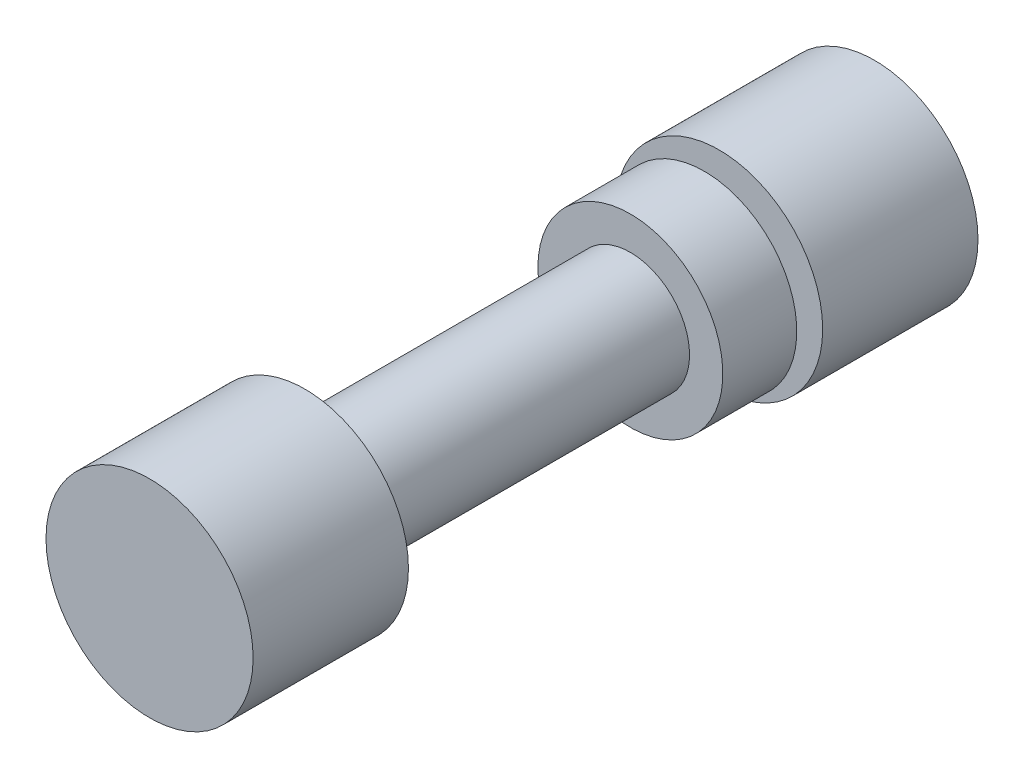
ISO-10303-21;
HEADER;
FILE_DESCRIPTION(('STEP AP214'),'2;1');
FILE_NAME('part.step','',(''),(''),'','','');
FILE_SCHEMA(('AUTOMOTIVE_DESIGN { 1 0 10303 214 1 1 1 1 }'));
ENDSEC;
DATA;
#1=APPLICATION_CONTEXT('core data for automotive mechanical design processes');
#2=APPLICATION_PROTOCOL_DEFINITION('international standard','automotive_design',2000,#1);
#3=PRODUCT_CONTEXT('',#1,'mechanical');
#4=PRODUCT('Part','Part','',(#3));
#5=PRODUCT_RELATED_PRODUCT_CATEGORY('part','',(#4));
#6=PRODUCT_DEFINITION_FORMATION('','',#4);
#7=PRODUCT_DEFINITION_CONTEXT('part definition',#1,'design');
#8=PRODUCT_DEFINITION('design','',#6,#7);
#9=PRODUCT_DEFINITION_SHAPE('','',#8);
#10=(LENGTH_UNIT() NAMED_UNIT(*) SI_UNIT(.MILLI.,.METRE.));
#11=(NAMED_UNIT(*) PLANE_ANGLE_UNIT() SI_UNIT($,.RADIAN.));
#12=(NAMED_UNIT(*) SI_UNIT($,.STERADIAN.) SOLID_ANGLE_UNIT());
#13=UNCERTAINTY_MEASURE_WITH_UNIT(LENGTH_MEASURE(1.E-05),#10,'distance_accuracy_value','');
#14=(GEOMETRIC_REPRESENTATION_CONTEXT(3) GLOBAL_UNCERTAINTY_ASSIGNED_CONTEXT((#13)) GLOBAL_UNIT_ASSIGNED_CONTEXT((#10,
#11,#12)) REPRESENTATION_CONTEXT('',''));
#15=CARTESIAN_POINT('',(0.,0.,0.));
#16=DIRECTION('',(0.,0.,1.));
#17=DIRECTION('',(1.,0.,0.));
#18=AXIS2_PLACEMENT_3D('',#15,#16,#17);
#19=CARTESIAN_POINT('',(4.,14.075,7.7));
#20=DIRECTION('',(0.,0.,-1.));
#21=DIRECTION('',(-1.,0.,0.));
#22=AXIS2_PLACEMENT_3D('',#19,#20,#21);
#23=CYLINDRICAL_SURFACE('',#22,0.8);
#24=CARTESIAN_POINT('',(4.,14.075,7.7));
#25=DIRECTION('',(0.,0.,1.));
#26=DIRECTION('',(1.,0.,0.));
#27=AXIS2_PLACEMENT_3D('',#24,#25,#26);
#28=CIRCLE('',#27,0.8);
#29=CARTESIAN_POINT('',(4.8,14.075,7.7));
#30=VERTEX_POINT('',#29);
#31=EDGE_CURVE('E56',#30,#30,#28,.T.);
#32=ORIENTED_EDGE('',*,*,#31,.F.);
#33=EDGE_LOOP('',(#32));
#34=FACE_BOUND('',#33,.T.);
#35=CARTESIAN_POINT('',(4.,14.075,3.3));
#36=DIRECTION('',(0.,0.,-1.));
#37=DIRECTION('',(-1.,0.,0.));
#38=AXIS2_PLACEMENT_3D('',#35,#36,#37);
#39=CIRCLE('',#38,0.8);
#40=CARTESIAN_POINT('',(3.2,14.075,3.3));
#41=VERTEX_POINT('',#40);
#42=EDGE_CURVE('E10',#41,#41,#39,.T.);
#43=ORIENTED_EDGE('',*,*,#42,.F.);
#44=EDGE_LOOP('',(#43));
#45=FACE_BOUND('',#44,.T.);
#46=ADVANCED_FACE('F37',(#34,#45),#23,.T.);
#47=CARTESIAN_POINT('',(4.,14.075,9.8));
#48=DIRECTION('',(0.,0.,-1.));
#49=DIRECTION('',(-1.,0.,0.));
#50=AXIS2_PLACEMENT_3D('',#47,#48,#49);
#51=CYLINDRICAL_SURFACE('',#50,1.4);
#52=CARTESIAN_POINT('',(4.,14.075,9.8));
#53=DIRECTION('',(0.,0.,1.));
#54=DIRECTION('',(1.,0.,0.));
#55=AXIS2_PLACEMENT_3D('',#52,#53,#54);
#56=CIRCLE('',#55,1.4);
#57=CARTESIAN_POINT('',(5.4,14.075,9.8));
#58=VERTEX_POINT('',#57);
#59=EDGE_CURVE('E67',#58,#58,#56,.T.);
#60=ORIENTED_EDGE('',*,*,#59,.F.);
#61=EDGE_LOOP('',(#60));
#62=FACE_BOUND('',#61,.T.);
#63=CARTESIAN_POINT('',(4.,14.075,7.7));
#64=DIRECTION('',(0.,0.,1.));
#65=DIRECTION('',(1.,0.,0.));
#66=AXIS2_PLACEMENT_3D('',#63,#64,#65);
#67=CIRCLE('',#66,1.4);
#68=CARTESIAN_POINT('',(5.4,14.075,7.7));
#69=VERTEX_POINT('',#68);
#70=EDGE_CURVE('E62',#69,#69,#67,.T.);
#71=ORIENTED_EDGE('',*,*,#70,.T.);
#72=EDGE_LOOP('',(#71));
#73=FACE_BOUND('',#72,.T.);
#74=ADVANCED_FACE('F87',(#62,#73),#51,.T.);
#75=CARTESIAN_POINT('',(4.,14.075,9.8));
#76=DIRECTION('',(0.,0.,1.));
#77=DIRECTION('',(1.,0.,0.));
#78=AXIS2_PLACEMENT_3D('',#75,#76,#77);
#79=PLANE('',#78);
#80=ORIENTED_EDGE('',*,*,#59,.T.);
#81=EDGE_LOOP('',(#80));
#82=FACE_BOUND('',#81,.T.);
#83=ADVANCED_FACE('F95',(#82),#79,.T.);
#84=CARTESIAN_POINT('',(4.,14.075,7.7));
#85=DIRECTION('',(0.,0.,1.));
#86=DIRECTION('',(1.,0.,0.));
#87=AXIS2_PLACEMENT_3D('',#84,#85,#86);
#88=PLANE('',#87);
#89=ORIENTED_EDGE('',*,*,#31,.T.);
#90=EDGE_LOOP('',(#89));
#91=FACE_BOUND('',#90,.T.);
#92=ORIENTED_EDGE('',*,*,#70,.F.);
#93=EDGE_LOOP('',(#92));
#94=FACE_BOUND('',#93,.T.);
#95=ADVANCED_FACE('F82',(#91,#94),#88,.F.);
#96=CARTESIAN_POINT('',(4.,14.075,3.3));
#97=DIRECTION('',(0.,0.,-1.));
#98=DIRECTION('',(-1.,0.,0.));
#99=AXIS2_PLACEMENT_3D('',#96,#97,#98);
#100=CYLINDRICAL_SURFACE('',#99,1.25);
#101=CARTESIAN_POINT('',(4.,14.075,3.3));
#102=DIRECTION('',(0.,0.,-1.));
#103=DIRECTION('',(-1.,0.,0.));
#104=AXIS2_PLACEMENT_3D('',#101,#102,#103);
#105=CIRCLE('',#104,1.25);
#106=CARTESIAN_POINT('',(2.75,14.075,3.3));
#107=VERTEX_POINT('',#106);
#108=EDGE_CURVE('E63',#107,#107,#105,.T.);
#109=ORIENTED_EDGE('',*,*,#108,.T.);
#110=EDGE_LOOP('',(#109));
#111=FACE_BOUND('',#110,.T.);
#112=CARTESIAN_POINT('',(4.,14.075,2.3));
#113=DIRECTION('',(0.,0.,-1.));
#114=DIRECTION('',(-1.,0.,0.));
#115=AXIS2_PLACEMENT_3D('',#112,#113,#114);
#116=CIRCLE('',#115,1.25);
#117=CARTESIAN_POINT('',(2.75,14.075,2.3));
#118=VERTEX_POINT('',#117);
#119=EDGE_CURVE('E69',#118,#118,#116,.T.);
#120=ORIENTED_EDGE('',*,*,#119,.F.);
#121=EDGE_LOOP('',(#120));
#122=FACE_BOUND('',#121,.T.);
#123=ADVANCED_FACE('F125',(#111,#122),#100,.T.);
#124=CARTESIAN_POINT('',(4.,14.075,3.3));
#125=DIRECTION('',(0.,0.,-1.));
#126=DIRECTION('',(-1.,0.,0.));
#127=AXIS2_PLACEMENT_3D('',#124,#125,#126);
#128=PLANE('',#127);
#129=ORIENTED_EDGE('',*,*,#42,.T.);
#130=EDGE_LOOP('',(#129));
#131=FACE_BOUND('',#130,.T.);
#132=ORIENTED_EDGE('',*,*,#108,.F.);
#133=EDGE_LOOP('',(#132));
#134=FACE_BOUND('',#133,.T.);
#135=ADVANCED_FACE('F117',(#131,#134),#128,.F.);
#136=CARTESIAN_POINT('',(4.,14.075,2.3));
#137=DIRECTION('',(0.,0.,-1.));
#138=DIRECTION('',(-1.,0.,0.));
#139=AXIS2_PLACEMENT_3D('',#136,#137,#138);
#140=PLANE('',#139);
#141=CARTESIAN_POINT('',(4.,14.075,2.3));
#142=DIRECTION('',(0.,0.,-1.));
#143=DIRECTION('',(-1.,0.,0.));
#144=AXIS2_PLACEMENT_3D('',#141,#142,#143);
#145=CIRCLE('',#144,0.8);
#146=CARTESIAN_POINT('',(3.2,14.075,2.3));
#147=VERTEX_POINT('',#146);
#148=EDGE_CURVE('E60',#147,#147,#145,.T.);
#149=ORIENTED_EDGE('',*,*,#148,.F.);
#150=EDGE_LOOP('',(#149));
#151=FACE_BOUND('',#150,.T.);
#152=ORIENTED_EDGE('',*,*,#119,.T.);
#153=EDGE_LOOP('',(#152));
#154=FACE_BOUND('',#153,.T.);
#155=ADVANCED_FACE('F113',(#151,#154),#140,.T.);
#156=CARTESIAN_POINT('',(4.,14.075,0.));
#157=DIRECTION('',(0.,0.,1.));
#158=DIRECTION('',(1.,0.,0.));
#159=AXIS2_PLACEMENT_3D('',#156,#157,#158);
#160=PLANE('',#159);
#161=CARTESIAN_POINT('',(4.,14.075,0.));
#162=DIRECTION('',(0.,0.,1.));
#163=DIRECTION('',(1.,0.,0.));
#164=AXIS2_PLACEMENT_3D('',#161,#162,#163);
#165=CIRCLE('',#164,1.4);
#166=CARTESIAN_POINT('',(5.4,14.075,0.));
#167=VERTEX_POINT('',#166);
#168=EDGE_CURVE('E53',#167,#167,#165,.T.);
#169=ORIENTED_EDGE('',*,*,#168,.F.);
#170=EDGE_LOOP('',(#169));
#171=FACE_BOUND('',#170,.T.);
#172=ADVANCED_FACE('F110',(#171),#160,.F.);
#173=CARTESIAN_POINT('',(4.,14.075,2.1));
#174=DIRECTION('',(0.,0.,-1.));
#175=DIRECTION('',(-1.,0.,0.));
#176=AXIS2_PLACEMENT_3D('',#173,#174,#175);
#177=CYLINDRICAL_SURFACE('',#176,1.4);
#178=CARTESIAN_POINT('',(4.,14.075,2.1));
#179=DIRECTION('',(0.,0.,1.));
#180=DIRECTION('',(1.,0.,0.));
#181=AXIS2_PLACEMENT_3D('',#178,#179,#180);
#182=CIRCLE('',#181,1.4);
#183=CARTESIAN_POINT('',(5.4,14.075,2.1));
#184=VERTEX_POINT('',#183);
#185=EDGE_CURVE('E48',#184,#184,#182,.T.);
#186=ORIENTED_EDGE('',*,*,#185,.F.);
#187=EDGE_LOOP('',(#186));
#188=FACE_BOUND('',#187,.T.);
#189=ORIENTED_EDGE('',*,*,#168,.T.);
#190=EDGE_LOOP('',(#189));
#191=FACE_BOUND('',#190,.T.);
#192=ADVANCED_FACE('F39',(#188,#191),#177,.T.);
#193=CARTESIAN_POINT('',(4.,14.075,2.1));
#194=DIRECTION('',(0.,0.,1.));
#195=DIRECTION('',(1.,0.,0.));
#196=AXIS2_PLACEMENT_3D('',#193,#194,#195);
#197=PLANE('',#196);
#198=CARTESIAN_POINT('',(4.,14.075,2.1));
#199=DIRECTION('',(0.,0.,1.));
#200=DIRECTION('',(1.,0.,0.));
#201=AXIS2_PLACEMENT_3D('',#198,#199,#200);
#202=CIRCLE('',#201,0.8);
#203=CARTESIAN_POINT('',(4.8,14.075,2.1));
#204=VERTEX_POINT('',#203);
#205=EDGE_CURVE('E44',#204,#204,#202,.T.);
#206=ORIENTED_EDGE('',*,*,#205,.F.);
#207=EDGE_LOOP('',(#206));
#208=FACE_BOUND('',#207,.T.);
#209=ORIENTED_EDGE('',*,*,#185,.T.);
#210=EDGE_LOOP('',(#209));
#211=FACE_BOUND('',#210,.T.);
#212=ADVANCED_FACE('F100',(#208,#211),#197,.T.);
#213=ORIENTED_EDGE('',*,*,#148,.T.);
#214=EDGE_LOOP('',(#213));
#215=FACE_BOUND('',#214,.T.);
#216=ORIENTED_EDGE('',*,*,#205,.T.);
#217=EDGE_LOOP('',(#216));
#218=FACE_BOUND('',#217,.T.);
#219=ADVANCED_FACE('F89',(#215,#218),#23,.T.);
#220=CLOSED_SHELL('',(#46,#74,#83,#95,#123,#135,#155,#172,#192,#212,#219));
#221=MANIFOLD_SOLID_BREP('B2',#220);
#222=ADVANCED_BREP_SHAPE_REPRESENTATION('',(#18,#221),#14);
#223=SHAPE_DEFINITION_REPRESENTATION(#9,#222);
ENDSEC;
END-ISO-10303-21;
